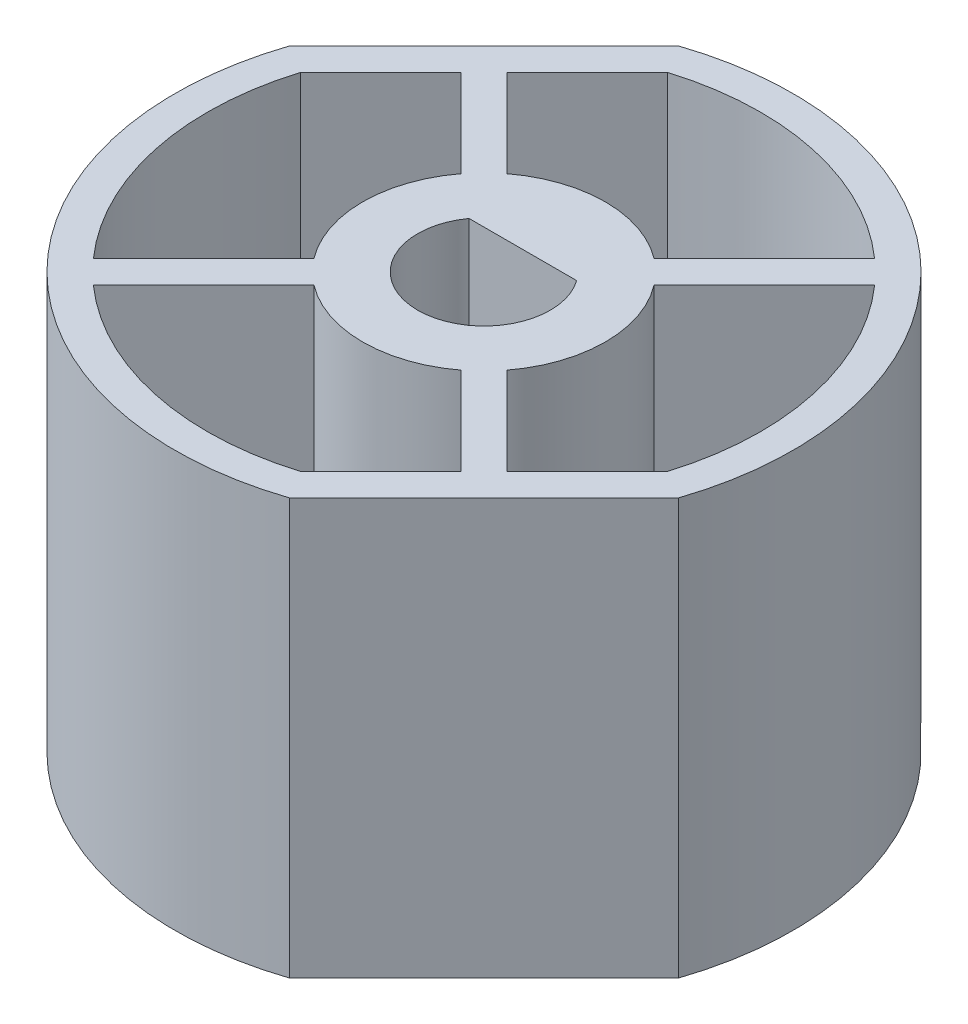
ISO-10303-21;
HEADER;
FILE_DESCRIPTION(('STEP AP214'),'2;1');
FILE_NAME('part.step','',(''),(''),'','','');
FILE_SCHEMA(('AUTOMOTIVE_DESIGN { 1 0 10303 214 1 1 1 1 }'));
ENDSEC;
DATA;
#1=APPLICATION_CONTEXT('core data for automotive mechanical design processes');
#2=APPLICATION_PROTOCOL_DEFINITION('international standard','automotive_design',2000,#1);
#3=PRODUCT_CONTEXT('',#1,'mechanical');
#4=PRODUCT('Part','Part','',(#3));
#5=PRODUCT_RELATED_PRODUCT_CATEGORY('part','',(#4));
#6=PRODUCT_DEFINITION_FORMATION('','',#4);
#7=PRODUCT_DEFINITION_CONTEXT('part definition',#1,'design');
#8=PRODUCT_DEFINITION('design','',#6,#7);
#9=PRODUCT_DEFINITION_SHAPE('','',#8);
#10=(LENGTH_UNIT() NAMED_UNIT(*) SI_UNIT(.MILLI.,.METRE.));
#11=(NAMED_UNIT(*) PLANE_ANGLE_UNIT() SI_UNIT($,.RADIAN.));
#12=(NAMED_UNIT(*) SI_UNIT($,.STERADIAN.) SOLID_ANGLE_UNIT());
#13=UNCERTAINTY_MEASURE_WITH_UNIT(LENGTH_MEASURE(1.E-05),#10,'distance_accuracy_value','');
#14=(GEOMETRIC_REPRESENTATION_CONTEXT(3) GLOBAL_UNCERTAINTY_ASSIGNED_CONTEXT((#13)) GLOBAL_UNIT_ASSIGNED_CONTEXT((#10,
#11,#12)) REPRESENTATION_CONTEXT('',''));
#15=CARTESIAN_POINT('',(0.,0.,0.));
#16=DIRECTION('',(0.,0.,1.));
#17=DIRECTION('',(1.,0.,0.));
#18=AXIS2_PLACEMENT_3D('',#15,#16,#17);
#19=CARTESIAN_POINT('',(0.,4.,0.));
#20=DIRECTION('',(0.,1.,0.));
#21=DIRECTION('',(0.,0.,1.));
#22=AXIS2_PLACEMENT_3D('',#19,#20,#21);
#23=PLANE('',#22);
#24=CARTESIAN_POINT('',(0.,4.,0.));
#25=DIRECTION('',(0.,1.,0.));
#26=DIRECTION('',(0.,0.,1.));
#27=AXIS2_PLACEMENT_3D('',#24,#25,#26);
#28=CIRCLE('',#27,7.5);
#29=CARTESIAN_POINT('',(-4.54884222922061,4.,5.96305579159371));
#30=VERTEX_POINT('',#29);
#31=CARTESIAN_POINT('',(4.54884222922061,4.,5.96305579159371));
#32=VERTEX_POINT('',#31);
#33=EDGE_CURVE('E283',#30,#32,#28,.T.);
#34=ORIENTED_EDGE('',*,*,#33,.F.);
#35=DIRECTION('',(0.707106781186547,0.,-0.707106781186548));
#36=VECTOR('',#35,1.);
#37=CARTESIAN_POINT('',(-3.60624458405139,4.,5.02045814642448));
#38=LINE('',#37,#36);
#39=CARTESIAN_POINT('',(-11.363725833012,4.,12.7779393953851));
#40=VERTEX_POINT('',#39);
#41=EDGE_CURVE('E277',#40,#30,#38,.T.);
#42=ORIENTED_EDGE('',*,*,#41,.F.);
#43=CARTESIAN_POINT('',(0.,4.,0.));
#44=DIRECTION('',(0.,1.,0.));
#45=DIRECTION('',(0.,0.,1.));
#46=AXIS2_PLACEMENT_3D('',#43,#44,#45);
#47=CIRCLE('',#46,17.1);
#48=CARTESIAN_POINT('',(5.00280801227241,4.,16.3518167795613));
#49=VERTEX_POINT('',#48);
#50=EDGE_CURVE('E585',#49,#40,#47,.F.);
#51=ORIENTED_EDGE('',*,*,#50,.F.);
#52=DIRECTION('',(0.707106781186548,0.,-0.707106781186548));
#53=VECTOR('',#52,1.);
#54=CARTESIAN_POINT('',(10.6773123959169,4.,10.6773123959169));
#55=LINE('',#54,#53);
#56=CARTESIAN_POINT('',(9.9702056147303,4.,11.3844191771034));
#57=VERTEX_POINT('',#56);
#58=EDGE_CURVE('E395',#49,#57,#55,.T.);
#59=ORIENTED_EDGE('',*,*,#58,.T.);
#60=DIRECTION('',(-0.707106781186547,0.,-0.707106781186548));
#61=VECTOR('',#60,1.);
#62=CARTESIAN_POINT('',(2.89913780286484,4.,4.31335136523793));
#63=LINE('',#62,#61);
#64=EDGE_CURVE('E346',#57,#32,#63,.T.);
#65=ORIENTED_EDGE('',*,*,#64,.T.);
#66=EDGE_LOOP('',(#34,#42,#51,#59,#65));
#67=FACE_BOUND('',#66,.T.);
#68=ADVANCED_FACE('F65',(#67),#23,.T.);
#69=CARTESIAN_POINT('',(0.,46.9132034355964,0.));
#70=DIRECTION('',(0.,-1.,0.));
#71=DIRECTION('',(0.,0.,-1.));
#72=AXIS2_PLACEMENT_3D('',#69,#70,#71);
#73=CYLINDRICAL_SURFACE('',#72,7.5);
#74=DIRECTION('',(0.,-1.,0.));
#75=VECTOR('',#74,1.);
#76=CARTESIAN_POINT('',(-4.54884222922061,46.9132034355964,5.96305579159371));
#77=LINE('',#76,#75);
#78=CARTESIAN_POINT('',(-4.54884222922061,25.7,5.96305579159371));
#79=VERTEX_POINT('',#78);
#80=EDGE_CURVE('E267',#30,#79,#77,.F.);
#81=ORIENTED_EDGE('',*,*,#80,.F.);
#82=ORIENTED_EDGE('',*,*,#33,.T.);
#83=DIRECTION('',(0.,-1.,0.));
#84=VECTOR('',#83,1.);
#85=CARTESIAN_POINT('',(4.54884222922061,46.9132034355964,5.96305579159371));
#86=LINE('',#85,#84);
#87=CARTESIAN_POINT('',(4.54884222922061,25.7,5.96305579159371));
#88=VERTEX_POINT('',#87);
#89=EDGE_CURVE('E343',#32,#88,#86,.F.);
#90=ORIENTED_EDGE('',*,*,#89,.T.);
#91=CARTESIAN_POINT('',(0.,25.7,0.));
#92=DIRECTION('',(0.,1.,0.));
#93=DIRECTION('',(0.,0.,1.));
#94=AXIS2_PLACEMENT_3D('',#91,#92,#93);
#95=CIRCLE('',#94,7.5);
#96=EDGE_CURVE('E319',#79,#88,#95,.T.);
#97=ORIENTED_EDGE('',*,*,#96,.F.);
#98=EDGE_LOOP('',(#81,#82,#90,#97));
#99=FACE_BOUND('',#98,.T.);
#100=ADVANCED_FACE('F391',(#99),#73,.T.);
#101=CARTESIAN_POINT('',(0.,-46.3661038331598,0.));
#102=DIRECTION('',(0.,1.,0.));
#103=DIRECTION('',(0.,0.,1.));
#104=AXIS2_PLACEMENT_3D('',#101,#102,#103);
#105=CYLINDRICAL_SURFACE('',#104,17.1);
#106=DIRECTION('',(0.,1.,0.));
#107=VECTOR('',#106,1.);
#108=CARTESIAN_POINT('',(-11.363725833012,-46.3661038331598,12.7779393953851));
#109=LINE('',#108,#107);
#110=CARTESIAN_POINT('',(-11.363725833012,25.7,12.7779393953851));
#111=VERTEX_POINT('',#110);
#112=EDGE_CURVE('E13',#111,#40,#109,.F.);
#113=ORIENTED_EDGE('',*,*,#112,.F.);
#114=CARTESIAN_POINT('',(0.,25.7,0.));
#115=DIRECTION('',(0.,1.,0.));
#116=DIRECTION('',(0.,0.,1.));
#117=AXIS2_PLACEMENT_3D('',#114,#115,#116);
#118=CIRCLE('',#117,17.1);
#119=CARTESIAN_POINT('',(5.00280801227241,25.7,16.3518167795613));
#120=VERTEX_POINT('',#119);
#121=EDGE_CURVE('E574',#111,#120,#118,.T.);
#122=ORIENTED_EDGE('',*,*,#121,.T.);
#123=DIRECTION('',(0.,1.,0.));
#124=VECTOR('',#123,1.);
#125=CARTESIAN_POINT('',(5.00280801227241,-46.3661038331598,16.3518167795613));
#126=LINE('',#125,#124);
#127=EDGE_CURVE('E569',#49,#120,#126,.T.);
#128=ORIENTED_EDGE('',*,*,#127,.F.);
#129=ORIENTED_EDGE('',*,*,#50,.T.);
#130=EDGE_LOOP('',(#113,#122,#128,#129));
#131=FACE_BOUND('',#130,.T.);
#132=ADVANCED_FACE('F443',(#131),#105,.F.);
#133=CARTESIAN_POINT('',(0.,4.,0.));
#134=DIRECTION('',(0.,1.,0.));
#135=DIRECTION('',(0.,0.,1.));
#136=AXIS2_PLACEMENT_3D('',#133,#134,#135);
#137=CIRCLE('',#136,17.1);
#138=CARTESIAN_POINT('',(12.7779393953851,4.,-11.363725833012));
#139=VERTEX_POINT('',#138);
#140=CARTESIAN_POINT('',(16.3518167795613,4.,5.00280801227241));
#141=VERTEX_POINT('',#140);
#142=EDGE_CURVE('E558',#139,#141,#137,.F.);
#143=ORIENTED_EDGE('',*,*,#142,.F.);
#144=DIRECTION('',(0.707106781186547,0.,-0.707106781186548));
#145=VECTOR('',#144,1.);
#146=CARTESIAN_POINT('',(12.7986327394765,4.,-11.3844191771034));
#147=LINE('',#146,#145);
#148=CARTESIAN_POINT('',(5.96305579159371,4.,-4.54884222922061));
#149=VERTEX_POINT('',#148);
#150=EDGE_CURVE('E370',#149,#139,#147,.T.);
#151=ORIENTED_EDGE('',*,*,#150,.F.);
#152=CARTESIAN_POINT('',(5.96305579159371,4.,4.54884222922061));
#153=VERTEX_POINT('',#152);
#154=EDGE_CURVE('E285',#153,#149,#28,.T.);
#155=ORIENTED_EDGE('',*,*,#154,.F.);
#156=DIRECTION('',(-0.707106781186547,0.,-0.707106781186548));
#157=VECTOR('',#156,1.);
#158=CARTESIAN_POINT('',(4.31335136523793,4.,2.89913780286484));
#159=LINE('',#158,#157);
#160=CARTESIAN_POINT('',(11.3844191771034,4.,9.9702056147303));
#161=VERTEX_POINT('',#160);
#162=EDGE_CURVE('E353',#161,#153,#159,.T.);
#163=ORIENTED_EDGE('',*,*,#162,.F.);
#164=EDGE_CURVE('E584',#161,#141,#55,.T.);
#165=ORIENTED_EDGE('',*,*,#164,.T.);
#166=EDGE_LOOP('',(#143,#151,#155,#163,#165));
#167=FACE_BOUND('',#166,.T.);
#168=ADVANCED_FACE('F435',(#167),#23,.T.);
#169=DIRECTION('',(0.,-1.,0.));
#170=VECTOR('',#169,1.);
#171=CARTESIAN_POINT('',(5.9630557915937,46.9132034355964,-4.54884222922061));
#172=LINE('',#171,#170);
#173=CARTESIAN_POINT('',(5.96305579159371,25.7,-4.54884222922062));
#174=VERTEX_POINT('',#173);
#175=EDGE_CURVE('E359',#174,#149,#172,.T.);
#176=ORIENTED_EDGE('',*,*,#175,.F.);
#177=CARTESIAN_POINT('',(5.96305579159371,25.7,4.54884222922061));
#178=VERTEX_POINT('',#177);
#179=EDGE_CURVE('E320',#178,#174,#95,.T.);
#180=ORIENTED_EDGE('',*,*,#179,.F.);
#181=DIRECTION('',(0.,-1.,0.));
#182=VECTOR('',#181,1.);
#183=CARTESIAN_POINT('',(5.96305579159371,46.9132034355964,4.54884222922061));
#184=LINE('',#183,#182);
#185=EDGE_CURVE('E338',#153,#178,#184,.F.);
#186=ORIENTED_EDGE('',*,*,#185,.F.);
#187=ORIENTED_EDGE('',*,*,#154,.T.);
#188=EDGE_LOOP('',(#176,#180,#186,#187));
#189=FACE_BOUND('',#188,.T.);
#190=ADVANCED_FACE('F422',(#189),#73,.T.);
#191=DIRECTION('',(0.,1.,0.));
#192=VECTOR('',#191,1.);
#193=CARTESIAN_POINT('',(12.7779393953851,-46.3661038331598,-11.363725833012));
#194=LINE('',#193,#192);
#195=CARTESIAN_POINT('',(12.7779393953851,25.7,-11.363725833012));
#196=VERTEX_POINT('',#195);
#197=EDGE_CURVE('E598',#139,#196,#194,.T.);
#198=ORIENTED_EDGE('',*,*,#197,.F.);
#199=ORIENTED_EDGE('',*,*,#142,.T.);
#200=DIRECTION('',(0.,1.,0.));
#201=VECTOR('',#200,1.);
#202=CARTESIAN_POINT('',(16.3518167795613,-46.3661038331598,5.00280801227241));
#203=LINE('',#202,#201);
#204=CARTESIAN_POINT('',(16.3518167795613,25.7,5.00280801227241));
#205=VERTEX_POINT('',#204);
#206=EDGE_CURVE('E559',#141,#205,#203,.T.);
#207=ORIENTED_EDGE('',*,*,#206,.T.);
#208=EDGE_CURVE('E576',#205,#196,#118,.T.);
#209=ORIENTED_EDGE('',*,*,#208,.T.);
#210=EDGE_LOOP('',(#198,#199,#207,#209));
#211=FACE_BOUND('',#210,.T.);
#212=ADVANCED_FACE('F431',(#211),#105,.F.);
#213=DIRECTION('',(0.707106781186547,0.,-0.707106781186548));
#214=VECTOR('',#213,1.);
#215=CARTESIAN_POINT('',(11.3844191771034,4.,-12.7986327394765));
#216=LINE('',#215,#214);
#217=CARTESIAN_POINT('',(4.54884222922061,4.,-5.96305579159371));
#218=VERTEX_POINT('',#217);
#219=CARTESIAN_POINT('',(11.363725833012,4.,-12.7779393953851));
#220=VERTEX_POINT('',#219);
#221=EDGE_CURVE('E367',#218,#220,#216,.T.);
#222=ORIENTED_EDGE('',*,*,#221,.T.);
#223=CARTESIAN_POINT('',(-5.00280801227243,4.,-16.3518167795613));
#224=VERTEX_POINT('',#223);
#225=EDGE_CURVE('E548',#224,#220,#137,.F.);
#226=ORIENTED_EDGE('',*,*,#225,.F.);
#227=DIRECTION('',(0.707106781186548,0.,-0.707106781186548));
#228=VECTOR('',#227,1.);
#229=CARTESIAN_POINT('',(-10.6773123959169,4.,-10.6773123959169));
#230=LINE('',#229,#228);
#231=CARTESIAN_POINT('',(-9.97020561473032,4.,-11.3844191771034));
#232=VERTEX_POINT('',#231);
#233=EDGE_CURVE('E571',#232,#224,#230,.T.);
#234=ORIENTED_EDGE('',*,*,#233,.F.);
#235=DIRECTION('',(-0.707106781186548,0.,-0.707106781186547));
#236=VECTOR('',#235,1.);
#237=CARTESIAN_POINT('',(-9.97020561473032,4.,-11.3844191771034));
#238=LINE('',#237,#236);
#239=CARTESIAN_POINT('',(-4.54884222922061,4.,-5.96305579159371));
#240=VERTEX_POINT('',#239);
#241=EDGE_CURVE('E332',#240,#232,#238,.T.);
#242=ORIENTED_EDGE('',*,*,#241,.F.);
#243=EDGE_CURVE('E289',#218,#240,#28,.T.);
#244=ORIENTED_EDGE('',*,*,#243,.F.);
#245=EDGE_LOOP('',(#222,#226,#234,#242,#244));
#246=FACE_BOUND('',#245,.T.);
#247=ADVANCED_FACE('F420',(#246),#23,.T.);
#248=CARTESIAN_POINT('',(4.54884222922061,25.7,-5.96305579159371));
#249=VERTEX_POINT('',#248);
#250=CARTESIAN_POINT('',(-4.54884222922061,25.7,-5.9630557915937));
#251=VERTEX_POINT('',#250);
#252=EDGE_CURVE('E287',#249,#251,#95,.T.);
#253=ORIENTED_EDGE('',*,*,#252,.F.);
#254=DIRECTION('',(0.,-1.,0.));
#255=VECTOR('',#254,1.);
#256=CARTESIAN_POINT('',(4.54884222922061,46.9132034355964,-5.96305579159371));
#257=LINE('',#256,#255);
#258=EDGE_CURVE('E365',#249,#218,#257,.T.);
#259=ORIENTED_EDGE('',*,*,#258,.T.);
#260=ORIENTED_EDGE('',*,*,#243,.T.);
#261=DIRECTION('',(0.,-1.,0.));
#262=VECTOR('',#261,1.);
#263=CARTESIAN_POINT('',(-4.54884222922061,46.9132034355964,-5.96305579159371));
#264=LINE('',#263,#262);
#265=EDGE_CURVE('E322',#251,#240,#264,.T.);
#266=ORIENTED_EDGE('',*,*,#265,.F.);
#267=EDGE_LOOP('',(#253,#259,#260,#266));
#268=FACE_BOUND('',#267,.T.);
#269=ADVANCED_FACE('F417',(#268),#73,.T.);
#270=CARTESIAN_POINT('',(10.6773123959169,-46.3661038331598,10.6773123959169));
#271=DIRECTION('',(-0.707106781186548,0.,-0.707106781186548));
#272=DIRECTION('',(-0.707106781186548,0.,0.707106781186548));
#273=AXIS2_PLACEMENT_3D('',#270,#271,#272);
#274=PLANE('',#273);
#275=ORIENTED_EDGE('',*,*,#164,.F.);
#276=DIRECTION('',(0.,1.,0.));
#277=VECTOR('',#276,1.);
#278=CARTESIAN_POINT('',(11.3844191771034,-9.,9.97020561473033));
#279=LINE('',#278,#277);
#280=CARTESIAN_POINT('',(11.3844191771034,25.7,9.97020561473032));
#281=VERTEX_POINT('',#280);
#282=EDGE_CURVE('E350',#161,#281,#279,.T.);
#283=ORIENTED_EDGE('',*,*,#282,.T.);
#284=DIRECTION('',(-0.707106781186548,0.,0.707106781186548));
#285=VECTOR('',#284,1.);
#286=CARTESIAN_POINT('',(10.6773123959169,25.7,10.6773123959169));
#287=LINE('',#286,#285);
#288=EDGE_CURVE('E580',#205,#281,#287,.T.);
#289=ORIENTED_EDGE('',*,*,#288,.F.);
#290=ORIENTED_EDGE('',*,*,#206,.F.);
#291=EDGE_LOOP('',(#275,#283,#289,#290));
#292=FACE_BOUND('',#291,.T.);
#293=ADVANCED_FACE('F419',(#292),#274,.T.);
#294=CARTESIAN_POINT('',(-10.6773123959169,-46.3661038331598,-10.6773123959169));
#295=DIRECTION('',(-0.707106781186548,0.,-0.707106781186548));
#296=DIRECTION('',(-0.707106781186548,0.,0.707106781186548));
#297=AXIS2_PLACEMENT_3D('',#294,#295,#296);
#298=PLANE('',#297);
#299=DIRECTION('',(0.,1.,0.));
#300=VECTOR('',#299,1.);
#301=CARTESIAN_POINT('',(-9.97020561473032,-9.,-11.3844191771034));
#302=LINE('',#301,#300);
#303=CARTESIAN_POINT('',(-9.97020561473032,25.7,-11.3844191771034));
#304=VERTEX_POINT('',#303);
#305=EDGE_CURVE('E326',#232,#304,#302,.T.);
#306=ORIENTED_EDGE('',*,*,#305,.F.);
#307=ORIENTED_EDGE('',*,*,#233,.T.);
#308=DIRECTION('',(0.,1.,0.));
#309=VECTOR('',#308,1.);
#310=CARTESIAN_POINT('',(-5.00280801227243,-46.3661038331598,-16.3518167795613));
#311=LINE('',#310,#309);
#312=CARTESIAN_POINT('',(-5.00280801227243,25.7,-16.3518167795613));
#313=VERTEX_POINT('',#312);
#314=EDGE_CURVE('E562',#224,#313,#311,.T.);
#315=ORIENTED_EDGE('',*,*,#314,.T.);
#316=DIRECTION('',(-0.707106781186548,0.,0.707106781186548));
#317=VECTOR('',#316,1.);
#318=CARTESIAN_POINT('',(-10.6773123959169,25.7,-10.6773123959169));
#319=LINE('',#318,#317);
#320=EDGE_CURVE('E572',#313,#304,#319,.T.);
#321=ORIENTED_EDGE('',*,*,#320,.T.);
#322=EDGE_LOOP('',(#306,#307,#315,#321));
#323=FACE_BOUND('',#322,.T.);
#324=ADVANCED_FACE('F427',(#323),#298,.F.);
#325=DIRECTION('',(0.707106781186547,0.,-0.707106781186548));
#326=VECTOR('',#325,1.);
#327=CARTESIAN_POINT('',(-5.02045814642448,4.,3.60624458405139));
#328=LINE('',#327,#326);
#329=CARTESIAN_POINT('',(-12.7779393953851,4.,11.363725833012));
#330=VERTEX_POINT('',#329);
#331=CARTESIAN_POINT('',(-5.96305579159371,4.,4.54884222922061));
#332=VERTEX_POINT('',#331);
#333=EDGE_CURVE('E80',#330,#332,#328,.T.);
#334=ORIENTED_EDGE('',*,*,#333,.T.);
#335=CARTESIAN_POINT('',(-5.96305579159371,4.,-4.54884222922061));
#336=VERTEX_POINT('',#335);
#337=EDGE_CURVE('E274',#336,#332,#28,.T.);
#338=ORIENTED_EDGE('',*,*,#337,.F.);
#339=DIRECTION('',(-0.707106781186548,0.,-0.707106781186547));
#340=VECTOR('',#339,1.);
#341=CARTESIAN_POINT('',(-11.3844191771034,4.,-9.97020561473032));
#342=LINE('',#341,#340);
#343=CARTESIAN_POINT('',(-11.3844191771034,4.,-9.97020561473032));
#344=VERTEX_POINT('',#343);
#345=EDGE_CURVE('E325',#336,#344,#342,.T.);
#346=ORIENTED_EDGE('',*,*,#345,.T.);
#347=CARTESIAN_POINT('',(-16.3518167795613,4.,-5.00280801227243));
#348=VERTEX_POINT('',#347);
#349=EDGE_CURVE('E587',#348,#344,#230,.T.);
#350=ORIENTED_EDGE('',*,*,#349,.F.);
#351=EDGE_CURVE('E276',#330,#348,#47,.F.);
#352=ORIENTED_EDGE('',*,*,#351,.F.);
#353=EDGE_LOOP('',(#334,#338,#346,#350,#352));
#354=FACE_BOUND('',#353,.T.);
#355=ADVANCED_FACE('F272',(#354),#23,.T.);
#356=ORIENTED_EDGE('',*,*,#337,.T.);
#357=DIRECTION('',(0.,-1.,0.));
#358=VECTOR('',#357,1.);
#359=CARTESIAN_POINT('',(-5.96305579159371,46.9132034355964,4.54884222922061));
#360=LINE('',#359,#358);
#361=CARTESIAN_POINT('',(-5.96305579159371,25.7,4.54884222922061));
#362=VERTEX_POINT('',#361);
#363=EDGE_CURVE('E259',#332,#362,#360,.F.);
#364=ORIENTED_EDGE('',*,*,#363,.T.);
#365=CARTESIAN_POINT('',(-5.96305579159371,25.7,-4.54884222922061));
#366=VERTEX_POINT('',#365);
#367=EDGE_CURVE('E316',#366,#362,#95,.T.);
#368=ORIENTED_EDGE('',*,*,#367,.F.);
#369=DIRECTION('',(0.,-1.,0.));
#370=VECTOR('',#369,1.);
#371=CARTESIAN_POINT('',(-5.96305579159371,46.9132034355964,-4.54884222922061));
#372=LINE('',#371,#370);
#373=EDGE_CURVE('E281',#366,#336,#372,.T.);
#374=ORIENTED_EDGE('',*,*,#373,.T.);
#375=EDGE_LOOP('',(#356,#364,#368,#374));
#376=FACE_BOUND('',#375,.T.);
#377=ADVANCED_FACE('F280',(#376),#73,.T.);
#378=CARTESIAN_POINT('',(0.,25.7,0.));
#379=DIRECTION('',(0.,1.,0.));
#380=DIRECTION('',(0.,0.,1.));
#381=AXIS2_PLACEMENT_3D('',#378,#379,#380);
#382=PLANE('',#381);
#383=ORIENTED_EDGE('',*,*,#367,.T.);
#384=DIRECTION('',(-0.707106781186547,0.,0.707106781186548));
#385=VECTOR('',#384,1.);
#386=CARTESIAN_POINT('',(-5.02045814642448,25.7,3.60624458405139));
#387=LINE('',#386,#385);
#388=CARTESIAN_POINT('',(-12.7779393953851,25.7,11.363725833012));
#389=VERTEX_POINT('',#388);
#390=EDGE_CURVE('E262',#362,#389,#387,.T.);
#391=ORIENTED_EDGE('',*,*,#390,.T.);
#392=CARTESIAN_POINT('',(-16.3518167795613,25.7,-5.00280801227243));
#393=VERTEX_POINT('',#392);
#394=EDGE_CURVE('E563',#393,#389,#118,.T.);
#395=ORIENTED_EDGE('',*,*,#394,.F.);
#396=CARTESIAN_POINT('',(-11.3844191771034,25.7,-9.97020561473032));
#397=VERTEX_POINT('',#396);
#398=EDGE_CURVE('E575',#397,#393,#319,.T.);
#399=ORIENTED_EDGE('',*,*,#398,.F.);
#400=DIRECTION('',(0.707106781186548,0.,0.707106781186547));
#401=VECTOR('',#400,1.);
#402=CARTESIAN_POINT('',(-11.3844191771034,25.7,-9.97020561473032));
#403=LINE('',#402,#401);
#404=EDGE_CURVE('E335',#397,#366,#403,.T.);
#405=ORIENTED_EDGE('',*,*,#404,.T.);
#406=EDGE_LOOP('',(#383,#391,#395,#399,#405));
#407=FACE_BOUND('',#406,.T.);
#408=DIRECTION('',(-0.707106781186547,0.,0.707106781186548));
#409=VECTOR('',#408,1.);
#410=CARTESIAN_POINT('',(-3.60624458405139,25.7,5.02045814642448));
#411=LINE('',#410,#409);
#412=EDGE_CURVE('E376',#79,#111,#411,.T.);
#413=ORIENTED_EDGE('',*,*,#412,.F.);
#414=ORIENTED_EDGE('',*,*,#96,.T.);
#415=DIRECTION('',(0.707106781186547,0.,0.707106781186548));
#416=VECTOR('',#415,1.);
#417=CARTESIAN_POINT('',(2.89913780286484,25.7,4.31335136523793));
#418=LINE('',#417,#416);
#419=CARTESIAN_POINT('',(9.97020561473032,25.7,11.3844191771034));
#420=VERTEX_POINT('',#419);
#421=EDGE_CURVE('E356',#88,#420,#418,.T.);
#422=ORIENTED_EDGE('',*,*,#421,.T.);
#423=EDGE_CURVE('E318',#420,#120,#287,.T.);
#424=ORIENTED_EDGE('',*,*,#423,.T.);
#425=ORIENTED_EDGE('',*,*,#121,.F.);
#426=EDGE_LOOP('',(#413,#414,#422,#424,#425));
#427=FACE_BOUND('',#426,.T.);
#428=ORIENTED_EDGE('',*,*,#179,.T.);
#429=DIRECTION('',(-0.707106781186547,0.,0.707106781186548));
#430=VECTOR('',#429,1.);
#431=CARTESIAN_POINT('',(12.7986327394765,25.7,-11.3844191771034));
#432=LINE('',#431,#430);
#433=EDGE_CURVE('E368',#196,#174,#432,.T.);
#434=ORIENTED_EDGE('',*,*,#433,.F.);
#435=ORIENTED_EDGE('',*,*,#208,.F.);
#436=ORIENTED_EDGE('',*,*,#288,.T.);
#437=DIRECTION('',(0.707106781186547,0.,0.707106781186548));
#438=VECTOR('',#437,1.);
#439=CARTESIAN_POINT('',(4.31335136523793,25.7,2.89913780286484));
#440=LINE('',#439,#438);
#441=EDGE_CURVE('E351',#178,#281,#440,.T.);
#442=ORIENTED_EDGE('',*,*,#441,.F.);
#443=EDGE_LOOP('',(#428,#434,#435,#436,#442));
#444=FACE_BOUND('',#443,.T.);
#445=DIRECTION('',(-0.707106781186547,0.,0.707106781186548));
#446=VECTOR('',#445,1.);
#447=CARTESIAN_POINT('',(11.3844191771034,25.7,-12.7986327394765));
#448=LINE('',#447,#446);
#449=CARTESIAN_POINT('',(11.363725833012,25.7,-12.7779393953851));
#450=VERTEX_POINT('',#449);
#451=EDGE_CURVE('E88',#450,#249,#448,.T.);
#452=ORIENTED_EDGE('',*,*,#451,.T.);
#453=ORIENTED_EDGE('',*,*,#252,.T.);
#454=DIRECTION('',(0.707106781186548,0.,0.707106781186547));
#455=VECTOR('',#454,1.);
#456=CARTESIAN_POINT('',(-9.97020561473032,25.7,-11.3844191771034));
#457=LINE('',#456,#455);
#458=EDGE_CURVE('E329',#304,#251,#457,.T.);
#459=ORIENTED_EDGE('',*,*,#458,.F.);
#460=ORIENTED_EDGE('',*,*,#320,.F.);
#461=EDGE_CURVE('E579',#450,#313,#118,.T.);
#462=ORIENTED_EDGE('',*,*,#461,.F.);
#463=EDGE_LOOP('',(#452,#453,#459,#460,#462));
#464=FACE_BOUND('',#463,.T.);
#465=DIRECTION('',(0.707106781186548,0.,-0.707106781186547));
#466=VECTOR('',#465,1.);
#467=CARTESIAN_POINT('',(12.09152595829,25.7,12.09152595829));
#468=LINE('',#467,#466);
#469=CARTESIAN_POINT('',(6.07488237569342,25.7,18.1081695408865));
#470=VERTEX_POINT('',#469);
#471=CARTESIAN_POINT('',(18.1081695408865,25.7,6.07488237569344));
#472=VERTEX_POINT('',#471);
#473=EDGE_CURVE('E552',#470,#472,#468,.T.);
#474=ORIENTED_EDGE('',*,*,#473,.T.);
#475=CARTESIAN_POINT('',(0.,25.7,0.));
#476=DIRECTION('',(0.,1.,0.));
#477=DIRECTION('',(0.,0.,1.));
#478=AXIS2_PLACEMENT_3D('',#475,#476,#477);
#479=CIRCLE('',#478,19.1);
#480=CARTESIAN_POINT('',(-6.07488237569344,25.7,-18.1081695408865));
#481=VERTEX_POINT('',#480);
#482=EDGE_CURVE('E516',#472,#481,#479,.T.);
#483=ORIENTED_EDGE('',*,*,#482,.T.);
#484=DIRECTION('',(-0.707106781186548,0.,0.707106781186547));
#485=VECTOR('',#484,1.);
#486=CARTESIAN_POINT('',(-12.09152595829,25.7,-12.09152595829));
#487=LINE('',#486,#485);
#488=CARTESIAN_POINT('',(-18.1081695408865,25.7,-6.07488237569345));
#489=VERTEX_POINT('',#488);
#490=EDGE_CURVE('E543',#481,#489,#487,.T.);
#491=ORIENTED_EDGE('',*,*,#490,.T.);
#492=EDGE_CURVE('E511',#489,#470,#479,.T.);
#493=ORIENTED_EDGE('',*,*,#492,.T.);
#494=EDGE_LOOP('',(#474,#483,#491,#493));
#495=FACE_BOUND('',#494,.T.);
#496=CARTESIAN_POINT('',(0.,25.7,0.));
#497=DIRECTION('',(0.,1.,0.));
#498=DIRECTION('',(0.,0.,1.));
#499=AXIS2_PLACEMENT_3D('',#496,#497,#498);
#500=CIRCLE('',#499,4.1);
#501=CARTESIAN_POINT('',(-3.32415402771893,25.7,-2.4));
#502=VERTEX_POINT('',#501);
#503=CARTESIAN_POINT('',(3.32415402771893,25.7,-2.4));
#504=VERTEX_POINT('',#503);
#505=EDGE_CURVE('E315',#502,#504,#500,.T.);
#506=ORIENTED_EDGE('',*,*,#505,.F.);
#507=DIRECTION('',(-1.,0.,0.));
#508=VECTOR('',#507,1.);
#509=CARTESIAN_POINT('',(0.,25.7,-2.4));
#510=LINE('',#509,#508);
#511=EDGE_CURVE('E282',#504,#502,#510,.T.);
#512=ORIENTED_EDGE('',*,*,#511,.F.);
#513=EDGE_LOOP('',(#506,#512));
#514=FACE_BOUND('',#513,.T.);
#515=ADVANCED_FACE('F401',(#407,#427,#444,#464,#495,#514),#382,.T.);
#516=CARTESIAN_POINT('',(0.,25.7,0.));
#517=DIRECTION('',(0.,-1.,0.));
#518=DIRECTION('',(0.,0.,-1.));
#519=AXIS2_PLACEMENT_3D('',#516,#517,#518);
#520=CYLINDRICAL_SURFACE('',#519,19.1);
#521=ORIENTED_EDGE('',*,*,#482,.F.);
#522=DIRECTION('',(0.,-1.,0.));
#523=VECTOR('',#522,1.);
#524=CARTESIAN_POINT('',(18.1081695408865,25.7,6.07488237569344));
#525=LINE('',#524,#523);
#526=CARTESIAN_POINT('',(18.1081695408865,0.,6.07488237569344));
#527=VERTEX_POINT('',#526);
#528=EDGE_CURVE('E532',#472,#527,#525,.T.);
#529=ORIENTED_EDGE('',*,*,#528,.T.);
#530=CARTESIAN_POINT('',(0.,0.,0.));
#531=DIRECTION('',(0.,1.,0.));
#532=DIRECTION('',(0.,0.,1.));
#533=AXIS2_PLACEMENT_3D('',#530,#531,#532);
#534=CIRCLE('',#533,19.1);
#535=CARTESIAN_POINT('',(14.194322950582,0.,-12.7801093882087));
#536=VERTEX_POINT('',#535);
#537=EDGE_CURVE('E493',#527,#536,#534,.T.);
#538=ORIENTED_EDGE('',*,*,#537,.T.);
#539=DIRECTION('',(0.,-1.,0.));
#540=VECTOR('',#539,1.);
#541=CARTESIAN_POINT('',(14.194322950582,25.7,-12.7801093882087));
#542=LINE('',#541,#540);
#543=CARTESIAN_POINT('',(14.194322950582,2.,-12.7801093882087));
#544=VERTEX_POINT('',#543);
#545=EDGE_CURVE('E503',#544,#536,#542,.T.);
#546=ORIENTED_EDGE('',*,*,#545,.F.);
#547=CARTESIAN_POINT('',(0.,2.,0.));
#548=DIRECTION('',(0.,1.,0.));
#549=DIRECTION('',(0.,0.,1.));
#550=AXIS2_PLACEMENT_3D('',#547,#548,#549);
#551=CIRCLE('',#550,19.1);
#552=CARTESIAN_POINT('',(12.7801093882089,2.,-14.1943229505818));
#553=VERTEX_POINT('',#552);
#554=EDGE_CURVE('E599',#544,#553,#551,.T.);
#555=ORIENTED_EDGE('',*,*,#554,.T.);
#556=DIRECTION('',(0.,-1.,0.));
#557=VECTOR('',#556,1.);
#558=CARTESIAN_POINT('',(12.7801093882089,25.7,-14.1943229505818));
#559=LINE('',#558,#557);
#560=CARTESIAN_POINT('',(12.7801093882089,0.,-14.1943229505818));
#561=VERTEX_POINT('',#560);
#562=EDGE_CURVE('E506',#561,#553,#559,.F.);
#563=ORIENTED_EDGE('',*,*,#562,.F.);
#564=CARTESIAN_POINT('',(-6.07488237569344,0.,-18.1081695408865));
#565=VERTEX_POINT('',#564);
#566=EDGE_CURVE('E505',#561,#565,#534,.T.);
#567=ORIENTED_EDGE('',*,*,#566,.T.);
#568=DIRECTION('',(0.,-1.,0.));
#569=VECTOR('',#568,1.);
#570=CARTESIAN_POINT('',(-6.07488237569344,25.7,-18.1081695408865));
#571=LINE('',#570,#569);
#572=EDGE_CURVE('E540',#481,#565,#571,.T.);
#573=ORIENTED_EDGE('',*,*,#572,.F.);
#574=EDGE_LOOP('',(#521,#529,#538,#546,#555,#563,#567,#573));
#575=FACE_BOUND('',#574,.T.);
#576=ADVANCED_FACE('F468',(#575),#520,.T.);
#577=CARTESIAN_POINT('',(-18.1081695408865,0.,-6.07488237569345));
#578=VERTEX_POINT('',#577);
#579=CARTESIAN_POINT('',(6.07488237569342,0.,18.1081695408865));
#580=VERTEX_POINT('',#579);
#581=EDGE_CURVE('E502',#578,#580,#534,.T.);
#582=ORIENTED_EDGE('',*,*,#581,.T.);
#583=DIRECTION('',(0.,-1.,0.));
#584=VECTOR('',#583,1.);
#585=CARTESIAN_POINT('',(6.07488237569342,25.7,18.1081695408865));
#586=LINE('',#585,#584);
#587=EDGE_CURVE('E550',#470,#580,#586,.T.);
#588=ORIENTED_EDGE('',*,*,#587,.F.);
#589=ORIENTED_EDGE('',*,*,#492,.F.);
#590=DIRECTION('',(0.,-1.,0.));
#591=VECTOR('',#590,1.);
#592=CARTESIAN_POINT('',(-18.1081695408865,25.7,-6.07488237569345));
#593=LINE('',#592,#591);
#594=EDGE_CURVE('E542',#489,#578,#593,.T.);
#595=ORIENTED_EDGE('',*,*,#594,.T.);
#596=EDGE_LOOP('',(#582,#588,#589,#595));
#597=FACE_BOUND('',#596,.T.);
#598=ADVANCED_FACE('F67',(#597),#520,.T.);
#599=CARTESIAN_POINT('',(0.,0.,0.));
#600=DIRECTION('',(0.,1.,0.));
#601=DIRECTION('',(0.,0.,1.));
#602=AXIS2_PLACEMENT_3D('',#599,#600,#601);
#603=PLANE('',#602);
#604=ORIENTED_EDGE('',*,*,#537,.F.);
#605=DIRECTION('',(0.707106781186548,0.,-0.707106781186547));
#606=VECTOR('',#605,1.);
#607=CARTESIAN_POINT('',(12.09152595829,0.,12.09152595829));
#608=LINE('',#607,#606);
#609=EDGE_CURVE('E495',#580,#527,#608,.T.);
#610=ORIENTED_EDGE('',*,*,#609,.F.);
#611=ORIENTED_EDGE('',*,*,#581,.F.);
#612=DIRECTION('',(-0.707106781186548,0.,0.707106781186547));
#613=VECTOR('',#612,1.);
#614=CARTESIAN_POINT('',(-12.09152595829,0.,-12.09152595829));
#615=LINE('',#614,#613);
#616=EDGE_CURVE('E546',#565,#578,#615,.T.);
#617=ORIENTED_EDGE('',*,*,#616,.F.);
#618=ORIENTED_EDGE('',*,*,#566,.F.);
#619=DIRECTION('',(0.707106781186552,0.,-0.707106781186543));
#620=VECTOR('',#619,1.);
#621=CARTESIAN_POINT('',(-0.707106781186507,0.,-0.707106781186515));
#622=LINE('',#621,#620);
#623=CARTESIAN_POINT('',(4.05317199613787,0.,-5.46738555851084));
#624=VERTEX_POINT('',#623);
#625=EDGE_CURVE('E521',#624,#561,#622,.T.);
#626=ORIENTED_EDGE('',*,*,#625,.F.);
#627=CARTESIAN_POINT('',(3.53553390593276,0.,-3.53553390593272));
#628=DIRECTION('',(0.,1.,0.));
#629=DIRECTION('',(0.,0.,1.));
#630=AXIS2_PLACEMENT_3D('',#627,#628,#629);
#631=CIRCLE('',#630,2.);
#632=CARTESIAN_POINT('',(5.4673855585109,0.,-4.05317199613774));
#633=VERTEX_POINT('',#632);
#634=EDGE_CURVE('E529',#624,#633,#631,.T.);
#635=ORIENTED_EDGE('',*,*,#634,.T.);
#636=DIRECTION('',(0.707106781186554,0.,-0.707106781186541));
#637=VECTOR('',#636,1.);
#638=CARTESIAN_POINT('',(4.2426406871193,0.,-2.82842712474617));
#639=LINE('',#638,#637);
#640=EDGE_CURVE('E498',#633,#536,#639,.T.);
#641=ORIENTED_EDGE('',*,*,#640,.T.);
#642=EDGE_LOOP('',(#604,#610,#611,#617,#618,#626,#635,#641));
#643=FACE_BOUND('',#642,.T.);
#644=ADVANCED_FACE('F478',(#643),#603,.F.);
#645=CARTESIAN_POINT('',(0.,2.,0.));
#646=DIRECTION('',(0.,1.,0.));
#647=DIRECTION('',(0.,0.,1.));
#648=AXIS2_PLACEMENT_3D('',#645,#646,#647);
#649=PLANE('',#648);
#650=DIRECTION('',(0.707106781186554,0.,-0.707106781186541));
#651=VECTOR('',#650,1.);
#652=CARTESIAN_POINT('',(4.2426406871193,2.,-2.82842712474617));
#653=LINE('',#652,#651);
#654=CARTESIAN_POINT('',(5.4673855585109,2.,-4.05317199613774));
#655=VERTEX_POINT('',#654);
#656=EDGE_CURVE('E536',#655,#544,#653,.T.);
#657=ORIENTED_EDGE('',*,*,#656,.F.);
#658=CARTESIAN_POINT('',(3.53553390593276,2.,-3.53553390593272));
#659=DIRECTION('',(0.,1.,0.));
#660=DIRECTION('',(0.,0.,1.));
#661=AXIS2_PLACEMENT_3D('',#658,#659,#660);
#662=CIRCLE('',#661,2.);
#663=CARTESIAN_POINT('',(4.05317199613787,2.,-5.46738555851084));
#664=VERTEX_POINT('',#663);
#665=EDGE_CURVE('E531',#664,#655,#662,.T.);
#666=ORIENTED_EDGE('',*,*,#665,.F.);
#667=DIRECTION('',(-0.707106781186551,0.,0.707106781186543));
#668=VECTOR('',#667,1.);
#669=CARTESIAN_POINT('',(13.4350288425445,2.,-14.8492424049174));
#670=LINE('',#669,#668);
#671=EDGE_CURVE('E528',#553,#664,#670,.T.);
#672=ORIENTED_EDGE('',*,*,#671,.F.);
#673=ORIENTED_EDGE('',*,*,#554,.F.);
#674=EDGE_LOOP('',(#657,#666,#672,#673));
#675=FACE_BOUND('',#674,.T.);
#676=ADVANCED_FACE('F480',(#675),#649,.F.);
#677=CARTESIAN_POINT('',(4.2426406871193,2.,-2.82842712474617));
#678=DIRECTION('',(-0.707106781186541,0.,-0.707106781186554));
#679=DIRECTION('',(-0.707106781186554,0.,0.707106781186541));
#680=AXIS2_PLACEMENT_3D('',#677,#678,#679);
#681=PLANE('',#680);
#682=ORIENTED_EDGE('',*,*,#545,.T.);
#683=ORIENTED_EDGE('',*,*,#640,.F.);
#684=DIRECTION('',(0.,-1.,0.));
#685=VECTOR('',#684,1.);
#686=CARTESIAN_POINT('',(5.4673855585109,2.,-4.05317199613774));
#687=LINE('',#686,#685);
#688=EDGE_CURVE('E524',#633,#655,#687,.F.);
#689=ORIENTED_EDGE('',*,*,#688,.T.);
#690=ORIENTED_EDGE('',*,*,#656,.T.);
#691=EDGE_LOOP('',(#682,#683,#689,#690));
#692=FACE_BOUND('',#691,.T.);
#693=ADVANCED_FACE('F486',(#692),#681,.T.);
#694=CARTESIAN_POINT('',(13.4350288425445,2.,-14.8492424049174));
#695=DIRECTION('',(0.707106781186543,0.,0.707106781186552));
#696=DIRECTION('',(0.707106781186552,0.,-0.707106781186543));
#697=AXIS2_PLACEMENT_3D('',#694,#695,#696);
#698=PLANE('',#697);
#699=ORIENTED_EDGE('',*,*,#562,.T.);
#700=ORIENTED_EDGE('',*,*,#671,.T.);
#701=DIRECTION('',(0.,-1.,0.));
#702=VECTOR('',#701,1.);
#703=CARTESIAN_POINT('',(4.05317199613787,2.,-5.46738555851084));
#704=LINE('',#703,#702);
#705=EDGE_CURVE('E526',#664,#624,#704,.T.);
#706=ORIENTED_EDGE('',*,*,#705,.T.);
#707=ORIENTED_EDGE('',*,*,#625,.T.);
#708=EDGE_LOOP('',(#699,#700,#706,#707));
#709=FACE_BOUND('',#708,.T.);
#710=ADVANCED_FACE('F626',(#709),#698,.T.);
#711=CARTESIAN_POINT('',(3.53553390593276,2.,-3.53553390593272));
#712=DIRECTION('',(0.,-1.,0.));
#713=DIRECTION('',(0.,0.,-1.));
#714=AXIS2_PLACEMENT_3D('',#711,#712,#713);
#715=CYLINDRICAL_SURFACE('',#714,2.);
#716=ORIENTED_EDGE('',*,*,#634,.F.);
#717=ORIENTED_EDGE('',*,*,#705,.F.);
#718=ORIENTED_EDGE('',*,*,#665,.T.);
#719=ORIENTED_EDGE('',*,*,#688,.F.);
#720=EDGE_LOOP('',(#716,#717,#718,#719));
#721=FACE_BOUND('',#720,.T.);
#722=ADVANCED_FACE('F476',(#721),#715,.F.);
#723=CARTESIAN_POINT('',(-12.09152595829,25.7,-12.09152595829));
#724=DIRECTION('',(0.707106781186547,0.,0.707106781186548));
#725=DIRECTION('',(0.707106781186548,0.,-0.707106781186547));
#726=AXIS2_PLACEMENT_3D('',#723,#724,#725);
#727=PLANE('',#726);
#728=ORIENTED_EDGE('',*,*,#616,.T.);
#729=ORIENTED_EDGE('',*,*,#594,.F.);
#730=ORIENTED_EDGE('',*,*,#490,.F.);
#731=ORIENTED_EDGE('',*,*,#572,.T.);
#732=EDGE_LOOP('',(#728,#729,#730,#731));
#733=FACE_BOUND('',#732,.T.);
#734=ADVANCED_FACE('F621',(#733),#727,.F.);
#735=CARTESIAN_POINT('',(12.09152595829,25.7,12.09152595829));
#736=DIRECTION('',(-0.707106781186547,0.,-0.707106781186548));
#737=DIRECTION('',(-0.707106781186548,0.,0.707106781186547));
#738=AXIS2_PLACEMENT_3D('',#735,#736,#737);
#739=PLANE('',#738);
#740=ORIENTED_EDGE('',*,*,#609,.T.);
#741=ORIENTED_EDGE('',*,*,#528,.F.);
#742=ORIENTED_EDGE('',*,*,#473,.F.);
#743=ORIENTED_EDGE('',*,*,#587,.T.);
#744=EDGE_LOOP('',(#740,#741,#742,#743));
#745=FACE_BOUND('',#744,.T.);
#746=ADVANCED_FACE('F617',(#745),#739,.F.);
#747=DIRECTION('',(0.,1.,0.));
#748=VECTOR('',#747,1.);
#749=CARTESIAN_POINT('',(9.97020561473032,-9.,11.3844191771034));
#750=LINE('',#749,#748);
#751=EDGE_CURVE('E347',#57,#420,#750,.T.);
#752=ORIENTED_EDGE('',*,*,#751,.F.);
#753=ORIENTED_EDGE('',*,*,#58,.F.);
#754=ORIENTED_EDGE('',*,*,#127,.T.);
#755=ORIENTED_EDGE('',*,*,#423,.F.);
#756=EDGE_LOOP('',(#752,#753,#754,#755));
#757=FACE_BOUND('',#756,.T.);
#758=ADVANCED_FACE('F430',(#757),#274,.T.);
#759=ORIENTED_EDGE('',*,*,#394,.T.);
#760=DIRECTION('',(0.,1.,0.));
#761=VECTOR('',#760,1.);
#762=CARTESIAN_POINT('',(-12.7779393953851,-46.3661038331598,11.363725833012));
#763=LINE('',#762,#761);
#764=EDGE_CURVE('E73',#389,#330,#763,.F.);
#765=ORIENTED_EDGE('',*,*,#764,.T.);
#766=ORIENTED_EDGE('',*,*,#351,.T.);
#767=DIRECTION('',(0.,1.,0.));
#768=VECTOR('',#767,1.);
#769=CARTESIAN_POINT('',(-16.3518167795613,-46.3661038331598,-5.00280801227243));
#770=LINE('',#769,#768);
#771=EDGE_CURVE('E566',#348,#393,#770,.T.);
#772=ORIENTED_EDGE('',*,*,#771,.T.);
#773=EDGE_LOOP('',(#759,#765,#766,#772));
#774=FACE_BOUND('',#773,.T.);
#775=ADVANCED_FACE('F606',(#774),#105,.F.);
#776=ORIENTED_EDGE('',*,*,#349,.T.);
#777=DIRECTION('',(0.,1.,0.));
#778=VECTOR('',#777,1.);
#779=CARTESIAN_POINT('',(-11.3844191771034,-9.,-9.97020561473032));
#780=LINE('',#779,#778);
#781=EDGE_CURVE('E328',#344,#397,#780,.T.);
#782=ORIENTED_EDGE('',*,*,#781,.T.);
#783=ORIENTED_EDGE('',*,*,#398,.T.);
#784=ORIENTED_EDGE('',*,*,#771,.F.);
#785=EDGE_LOOP('',(#776,#782,#783,#784));
#786=FACE_BOUND('',#785,.T.);
#787=ADVANCED_FACE('F453',(#786),#298,.F.);
#788=ORIENTED_EDGE('',*,*,#225,.T.);
#789=DIRECTION('',(0.,1.,0.));
#790=VECTOR('',#789,1.);
#791=CARTESIAN_POINT('',(11.363725833012,-46.3661038331598,-12.7779393953851));
#792=LINE('',#791,#790);
#793=EDGE_CURVE('E597',#220,#450,#792,.T.);
#794=ORIENTED_EDGE('',*,*,#793,.T.);
#795=ORIENTED_EDGE('',*,*,#461,.T.);
#796=ORIENTED_EDGE('',*,*,#314,.F.);
#797=EDGE_LOOP('',(#788,#794,#795,#796));
#798=FACE_BOUND('',#797,.T.);
#799=ADVANCED_FACE('F595',(#798),#105,.F.);
#800=CARTESIAN_POINT('',(0.,46.9132034355964,-2.4));
#801=DIRECTION('',(0.,0.,1.));
#802=DIRECTION('',(1.,0.,0.));
#803=AXIS2_PLACEMENT_3D('',#800,#801,#802);
#804=PLANE('',#803);
#805=DIRECTION('',(0.,-1.,0.));
#806=VECTOR('',#805,1.);
#807=CARTESIAN_POINT('',(3.32415402771893,46.9132034355964,-2.4));
#808=LINE('',#807,#806);
#809=CARTESIAN_POINT('',(3.32415402771893,4.,-2.4));
#810=VERTEX_POINT('',#809);
#811=EDGE_CURVE('E295',#504,#810,#808,.T.);
#812=ORIENTED_EDGE('',*,*,#811,.F.);
#813=ORIENTED_EDGE('',*,*,#511,.T.);
#814=DIRECTION('',(0.,-1.,0.));
#815=VECTOR('',#814,1.);
#816=CARTESIAN_POINT('',(-3.32415402771893,46.9132034355964,-2.4));
#817=LINE('',#816,#815);
#818=CARTESIAN_POINT('',(-3.32415402771893,4.,-2.4));
#819=VERTEX_POINT('',#818);
#820=EDGE_CURVE('E302',#502,#819,#817,.T.);
#821=ORIENTED_EDGE('',*,*,#820,.T.);
#822=DIRECTION('',(-1.,0.,0.));
#823=VECTOR('',#822,1.);
#824=CARTESIAN_POINT('',(0.,4.,-2.4));
#825=LINE('',#824,#823);
#826=EDGE_CURVE('E309',#810,#819,#825,.T.);
#827=ORIENTED_EDGE('',*,*,#826,.F.);
#828=EDGE_LOOP('',(#812,#813,#821,#827));
#829=FACE_BOUND('',#828,.T.);
#830=ADVANCED_FACE('F463',(#829),#804,.T.);
#831=CARTESIAN_POINT('',(0.,46.9132034355964,0.));
#832=DIRECTION('',(0.,-1.,0.));
#833=DIRECTION('',(0.,0.,-1.));
#834=AXIS2_PLACEMENT_3D('',#831,#832,#833);
#835=CYLINDRICAL_SURFACE('',#834,4.1);
#836=ORIENTED_EDGE('',*,*,#820,.F.);
#837=ORIENTED_EDGE('',*,*,#505,.T.);
#838=ORIENTED_EDGE('',*,*,#811,.T.);
#839=CARTESIAN_POINT('',(0.,4.,0.));
#840=DIRECTION('',(0.,1.,0.));
#841=DIRECTION('',(0.,0.,1.));
#842=AXIS2_PLACEMENT_3D('',#839,#840,#841);
#843=CIRCLE('',#842,4.1);
#844=EDGE_CURVE('E313',#819,#810,#843,.T.);
#845=ORIENTED_EDGE('',*,*,#844,.F.);
#846=EDGE_LOOP('',(#836,#837,#838,#845));
#847=FACE_BOUND('',#846,.T.);
#848=ADVANCED_FACE('F455',(#847),#835,.F.);
#849=ORIENTED_EDGE('',*,*,#826,.T.);
#850=ORIENTED_EDGE('',*,*,#844,.T.);
#851=EDGE_LOOP('',(#849,#850));
#852=FACE_BOUND('',#851,.T.);
#853=ADVANCED_FACE('F434',(#852),#23,.T.);
#854=CARTESIAN_POINT('',(-9.97020561473032,-9.,-11.3844191771034));
#855=DIRECTION('',(-0.707106781186547,0.,0.707106781186548));
#856=DIRECTION('',(0.707106781186548,0.,0.707106781186547));
#857=AXIS2_PLACEMENT_3D('',#854,#855,#856);
#858=PLANE('',#857);
#859=ORIENTED_EDGE('',*,*,#458,.T.);
#860=ORIENTED_EDGE('',*,*,#265,.T.);
#861=ORIENTED_EDGE('',*,*,#241,.T.);
#862=ORIENTED_EDGE('',*,*,#305,.T.);
#863=EDGE_LOOP('',(#859,#860,#861,#862));
#864=FACE_BOUND('',#863,.T.);
#865=ADVANCED_FACE('F414',(#864),#858,.F.);
#866=CARTESIAN_POINT('',(-11.3844191771034,-9.,-9.97020561473032));
#867=DIRECTION('',(-0.707106781186547,0.,0.707106781186548));
#868=DIRECTION('',(0.707106781186548,0.,0.707106781186547));
#869=AXIS2_PLACEMENT_3D('',#866,#867,#868);
#870=PLANE('',#869);
#871=ORIENTED_EDGE('',*,*,#373,.F.);
#872=ORIENTED_EDGE('',*,*,#404,.F.);
#873=ORIENTED_EDGE('',*,*,#781,.F.);
#874=ORIENTED_EDGE('',*,*,#345,.F.);
#875=EDGE_LOOP('',(#871,#872,#873,#874));
#876=FACE_BOUND('',#875,.T.);
#877=ADVANCED_FACE('F461',(#876),#870,.T.);
#878=CARTESIAN_POINT('',(4.31335136523793,-9.,2.89913780286484));
#879=DIRECTION('',(-0.707106781186548,0.,0.707106781186547));
#880=DIRECTION('',(0.707106781186547,0.,0.707106781186548));
#881=AXIS2_PLACEMENT_3D('',#878,#879,#880);
#882=PLANE('',#881);
#883=ORIENTED_EDGE('',*,*,#162,.T.);
#884=ORIENTED_EDGE('',*,*,#185,.T.);
#885=ORIENTED_EDGE('',*,*,#441,.T.);
#886=ORIENTED_EDGE('',*,*,#282,.F.);
#887=EDGE_LOOP('',(#883,#884,#885,#886));
#888=FACE_BOUND('',#887,.T.);
#889=ADVANCED_FACE('F699',(#888),#882,.F.);
#890=CARTESIAN_POINT('',(2.89913780286484,-9.,4.31335136523793));
#891=DIRECTION('',(-0.707106781186548,0.,0.707106781186547));
#892=DIRECTION('',(0.707106781186547,0.,0.707106781186548));
#893=AXIS2_PLACEMENT_3D('',#890,#891,#892);
#894=PLANE('',#893);
#895=ORIENTED_EDGE('',*,*,#89,.F.);
#896=ORIENTED_EDGE('',*,*,#64,.F.);
#897=ORIENTED_EDGE('',*,*,#751,.T.);
#898=ORIENTED_EDGE('',*,*,#421,.F.);
#899=EDGE_LOOP('',(#895,#896,#897,#898));
#900=FACE_BOUND('',#899,.T.);
#901=ADVANCED_FACE('F398',(#900),#894,.T.);
#902=CARTESIAN_POINT('',(12.7986327394765,-9.,-11.3844191771034));
#903=DIRECTION('',(-0.707106781186548,0.,-0.707106781186547));
#904=DIRECTION('',(-0.707106781186547,0.,0.707106781186548));
#905=AXIS2_PLACEMENT_3D('',#902,#903,#904);
#906=PLANE('',#905);
#907=ORIENTED_EDGE('',*,*,#433,.T.);
#908=ORIENTED_EDGE('',*,*,#175,.T.);
#909=ORIENTED_EDGE('',*,*,#150,.T.);
#910=ORIENTED_EDGE('',*,*,#197,.T.);
#911=EDGE_LOOP('',(#907,#908,#909,#910));
#912=FACE_BOUND('',#911,.T.);
#913=ADVANCED_FACE('F719',(#912),#906,.F.);
#914=CARTESIAN_POINT('',(11.3844191771034,-9.,-12.7986327394765));
#915=DIRECTION('',(-0.707106781186548,0.,-0.707106781186547));
#916=DIRECTION('',(-0.707106781186547,0.,0.707106781186548));
#917=AXIS2_PLACEMENT_3D('',#914,#915,#916);
#918=PLANE('',#917);
#919=ORIENTED_EDGE('',*,*,#258,.F.);
#920=ORIENTED_EDGE('',*,*,#451,.F.);
#921=ORIENTED_EDGE('',*,*,#793,.F.);
#922=ORIENTED_EDGE('',*,*,#221,.F.);
#923=EDGE_LOOP('',(#919,#920,#921,#922));
#924=FACE_BOUND('',#923,.T.);
#925=ADVANCED_FACE('F596',(#924),#918,.T.);
#926=CARTESIAN_POINT('',(-3.60624458405139,-9.,5.02045814642448));
#927=DIRECTION('',(-0.707106781186548,0.,-0.707106781186547));
#928=DIRECTION('',(-0.707106781186547,0.,0.707106781186548));
#929=AXIS2_PLACEMENT_3D('',#926,#927,#928);
#930=PLANE('',#929);
#931=ORIENTED_EDGE('',*,*,#41,.T.);
#932=ORIENTED_EDGE('',*,*,#80,.T.);
#933=ORIENTED_EDGE('',*,*,#412,.T.);
#934=ORIENTED_EDGE('',*,*,#112,.T.);
#935=EDGE_LOOP('',(#931,#932,#933,#934));
#936=FACE_BOUND('',#935,.T.);
#937=ADVANCED_FACE('F382',(#936),#930,.F.);
#938=CARTESIAN_POINT('',(-5.02045814642448,-9.,3.60624458405139));
#939=DIRECTION('',(-0.707106781186548,0.,-0.707106781186547));
#940=DIRECTION('',(-0.707106781186547,0.,0.707106781186548));
#941=AXIS2_PLACEMENT_3D('',#938,#939,#940);
#942=PLANE('',#941);
#943=ORIENTED_EDGE('',*,*,#363,.F.);
#944=ORIENTED_EDGE('',*,*,#333,.F.);
#945=ORIENTED_EDGE('',*,*,#764,.F.);
#946=ORIENTED_EDGE('',*,*,#390,.F.);
#947=EDGE_LOOP('',(#943,#944,#945,#946));
#948=FACE_BOUND('',#947,.T.);
#949=ADVANCED_FACE('F260',(#948),#942,.T.);
#950=CLOSED_SHELL('',(#68,#100,#132,#168,#190,#212,#247,#269,#293,#324,#355,#377,#515,#576,#598,
#644,#676,#693,#710,#722,#734,#746,#758,#775,#787,#799,#830,#848,#853,#865,#877,#889,#901,#913,
#925,#937,#949));
#951=MANIFOLD_SOLID_BREP('B2',#950);
#952=ADVANCED_BREP_SHAPE_REPRESENTATION('',(#18,#951),#14);
#953=SHAPE_DEFINITION_REPRESENTATION(#9,#952);
ENDSEC;
END-ISO-10303-21;
